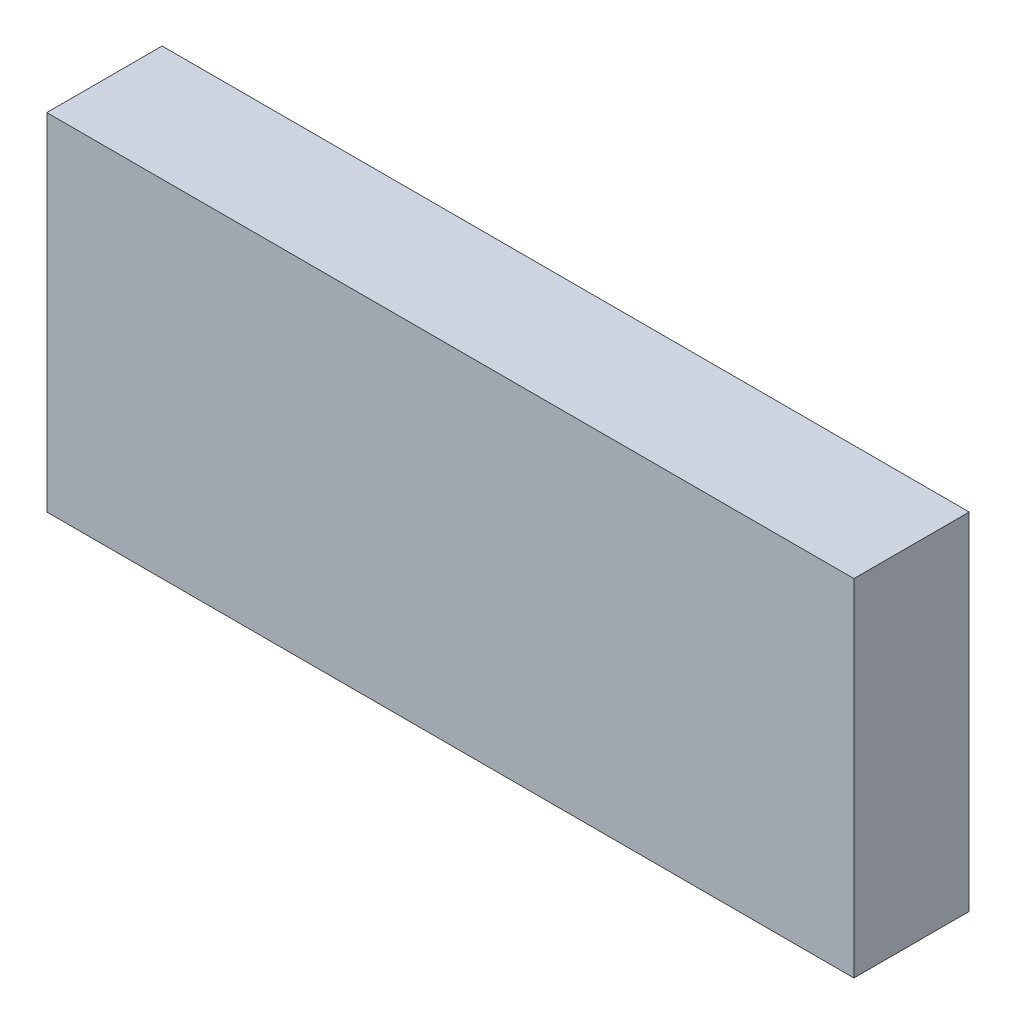
ISO-10303-21;
HEADER;
FILE_DESCRIPTION(('STEP AP214'),'2;1');
FILE_NAME('part.step','',(''),(''),'','','');
FILE_SCHEMA(('AUTOMOTIVE_DESIGN { 1 0 10303 214 1 1 1 1 }'));
ENDSEC;
DATA;
#1=APPLICATION_CONTEXT('core data for automotive mechanical design processes');
#2=APPLICATION_PROTOCOL_DEFINITION('international standard','automotive_design',2000,#1);
#3=PRODUCT_CONTEXT('',#1,'mechanical');
#4=PRODUCT('Part','Part','',(#3));
#5=PRODUCT_RELATED_PRODUCT_CATEGORY('part','',(#4));
#6=PRODUCT_DEFINITION_FORMATION('','',#4);
#7=PRODUCT_DEFINITION_CONTEXT('part definition',#1,'design');
#8=PRODUCT_DEFINITION('design','',#6,#7);
#9=PRODUCT_DEFINITION_SHAPE('','',#8);
#10=(LENGTH_UNIT() NAMED_UNIT(*) SI_UNIT(.MILLI.,.METRE.));
#11=(NAMED_UNIT(*) PLANE_ANGLE_UNIT() SI_UNIT($,.RADIAN.));
#12=(NAMED_UNIT(*) SI_UNIT($,.STERADIAN.) SOLID_ANGLE_UNIT());
#13=UNCERTAINTY_MEASURE_WITH_UNIT(LENGTH_MEASURE(1.E-05),#10,'distance_accuracy_value','');
#14=(GEOMETRIC_REPRESENTATION_CONTEXT(3) GLOBAL_UNCERTAINTY_ASSIGNED_CONTEXT((#13)) GLOBAL_UNIT_ASSIGNED_CONTEXT((#10,
#11,#12)) REPRESENTATION_CONTEXT('',''));
#15=CARTESIAN_POINT('',(0.,0.,0.));
#16=DIRECTION('',(0.,0.,1.));
#17=DIRECTION('',(1.,0.,0.));
#18=AXIS2_PLACEMENT_3D('',#15,#16,#17);
#19=CARTESIAN_POINT('',(0.,0.,1.5));
#20=DIRECTION('',(0.,0.,1.));
#21=DIRECTION('',(1.,0.,0.));
#22=AXIS2_PLACEMENT_3D('',#19,#20,#21);
#23=PLANE('',#22);
#24=DIRECTION('',(1.,0.,0.));
#25=VECTOR('',#24,1.);
#26=CARTESIAN_POINT('',(5.25,2.25,1.5));
#27=LINE('',#26,#25);
#28=CARTESIAN_POINT('',(-5.25,2.25,1.5));
#29=VERTEX_POINT('',#28);
#30=CARTESIAN_POINT('',(5.25,2.25,1.5));
#31=VERTEX_POINT('',#30);
#32=EDGE_CURVE('E68',#29,#31,#27,.T.);
#33=ORIENTED_EDGE('',*,*,#32,.F.);
#34=DIRECTION('',(0.,1.,0.));
#35=VECTOR('',#34,1.);
#36=CARTESIAN_POINT('',(-5.25,2.25,1.5));
#37=LINE('',#36,#35);
#38=CARTESIAN_POINT('',(-5.25,-2.25,1.5));
#39=VERTEX_POINT('',#38);
#40=EDGE_CURVE('E20',#39,#29,#37,.T.);
#41=ORIENTED_EDGE('',*,*,#40,.F.);
#42=DIRECTION('',(1.,0.,0.));
#43=VECTOR('',#42,1.);
#44=CARTESIAN_POINT('',(-5.25,-2.25,1.5));
#45=LINE('',#44,#43);
#46=CARTESIAN_POINT('',(5.25,-2.25,1.5));
#47=VERTEX_POINT('',#46);
#48=EDGE_CURVE('E58',#47,#39,#45,.F.);
#49=ORIENTED_EDGE('',*,*,#48,.F.);
#50=DIRECTION('',(0.,1.,0.));
#51=VECTOR('',#50,1.);
#52=CARTESIAN_POINT('',(5.25,-2.25,1.5));
#53=LINE('',#52,#51);
#54=EDGE_CURVE('E53',#31,#47,#53,.F.);
#55=ORIENTED_EDGE('',*,*,#54,.F.);
#56=EDGE_LOOP('',(#33,#41,#49,#55));
#57=FACE_BOUND('',#56,.T.);
#58=ADVANCED_FACE('F17',(#57),#23,.T.);
#59=CARTESIAN_POINT('',(-5.25,2.25,0.));
#60=DIRECTION('',(-1.,0.,0.));
#61=DIRECTION('',(0.,0.,1.));
#62=AXIS2_PLACEMENT_3D('',#59,#60,#61);
#63=PLANE('',#62);
#64=DIRECTION('',(0.,0.,1.));
#65=VECTOR('',#64,1.);
#66=CARTESIAN_POINT('',(-5.25,2.25,0.));
#67=LINE('',#66,#65);
#68=CARTESIAN_POINT('',(-5.25,2.25,0.));
#69=VERTEX_POINT('',#68);
#70=EDGE_CURVE('E79',#69,#29,#67,.T.);
#71=ORIENTED_EDGE('',*,*,#70,.F.);
#72=DIRECTION('',(0.,1.,0.));
#73=VECTOR('',#72,1.);
#74=CARTESIAN_POINT('',(-5.25,0.,0.));
#75=LINE('',#74,#73);
#76=CARTESIAN_POINT('',(-5.25,-2.25,0.));
#77=VERTEX_POINT('',#76);
#78=EDGE_CURVE('E74',#69,#77,#75,.F.);
#79=ORIENTED_EDGE('',*,*,#78,.T.);
#80=DIRECTION('',(0.,0.,-1.));
#81=VECTOR('',#80,1.);
#82=CARTESIAN_POINT('',(-5.25,-2.25,0.));
#83=LINE('',#82,#81);
#84=EDGE_CURVE('E63',#39,#77,#83,.T.);
#85=ORIENTED_EDGE('',*,*,#84,.F.);
#86=ORIENTED_EDGE('',*,*,#40,.T.);
#87=EDGE_LOOP('',(#71,#79,#85,#86));
#88=FACE_BOUND('',#87,.T.);
#89=ADVANCED_FACE('F73',(#88),#63,.T.);
#90=CARTESIAN_POINT('',(-5.25,-2.25,0.));
#91=DIRECTION('',(0.,-1.,0.));
#92=DIRECTION('',(0.,0.,-1.));
#93=AXIS2_PLACEMENT_3D('',#90,#91,#92);
#94=PLANE('',#93);
#95=ORIENTED_EDGE('',*,*,#84,.T.);
#96=DIRECTION('',(1.,0.,0.));
#97=VECTOR('',#96,1.);
#98=CARTESIAN_POINT('',(0.,-2.25,0.));
#99=LINE('',#98,#97);
#100=CARTESIAN_POINT('',(5.25,-2.25,0.));
#101=VERTEX_POINT('',#100);
#102=EDGE_CURVE('E84',#77,#101,#99,.T.);
#103=ORIENTED_EDGE('',*,*,#102,.T.);
#104=DIRECTION('',(0.,0.,-1.));
#105=VECTOR('',#104,1.);
#106=CARTESIAN_POINT('',(5.25,-2.25,0.));
#107=LINE('',#106,#105);
#108=EDGE_CURVE('E65',#47,#101,#107,.T.);
#109=ORIENTED_EDGE('',*,*,#108,.F.);
#110=ORIENTED_EDGE('',*,*,#48,.T.);
#111=EDGE_LOOP('',(#95,#103,#109,#110));
#112=FACE_BOUND('',#111,.T.);
#113=ADVANCED_FACE('F60',(#112),#94,.T.);
#114=CARTESIAN_POINT('',(5.25,-2.25,0.));
#115=DIRECTION('',(1.,0.,0.));
#116=DIRECTION('',(0.,0.,-1.));
#117=AXIS2_PLACEMENT_3D('',#114,#115,#116);
#118=PLANE('',#117);
#119=ORIENTED_EDGE('',*,*,#108,.T.);
#120=DIRECTION('',(0.,1.,0.));
#121=VECTOR('',#120,1.);
#122=CARTESIAN_POINT('',(5.25,0.,0.));
#123=LINE('',#122,#121);
#124=CARTESIAN_POINT('',(5.25,2.25,0.));
#125=VERTEX_POINT('',#124);
#126=EDGE_CURVE('E26',#101,#125,#123,.T.);
#127=ORIENTED_EDGE('',*,*,#126,.T.);
#128=DIRECTION('',(0.,0.,1.));
#129=VECTOR('',#128,1.);
#130=CARTESIAN_POINT('',(5.25,2.25,0.));
#131=LINE('',#130,#129);
#132=EDGE_CURVE('E34',#31,#125,#131,.F.);
#133=ORIENTED_EDGE('',*,*,#132,.F.);
#134=ORIENTED_EDGE('',*,*,#54,.T.);
#135=EDGE_LOOP('',(#119,#127,#133,#134));
#136=FACE_BOUND('',#135,.T.);
#137=ADVANCED_FACE('F88',(#136),#118,.T.);
#138=CARTESIAN_POINT('',(5.25,2.25,0.));
#139=DIRECTION('',(0.,1.,0.));
#140=DIRECTION('',(0.,0.,1.));
#141=AXIS2_PLACEMENT_3D('',#138,#139,#140);
#142=PLANE('',#141);
#143=ORIENTED_EDGE('',*,*,#132,.T.);
#144=DIRECTION('',(1.,0.,0.));
#145=VECTOR('',#144,1.);
#146=CARTESIAN_POINT('',(0.,2.25,0.));
#147=LINE('',#146,#145);
#148=EDGE_CURVE('E11',#125,#69,#147,.F.);
#149=ORIENTED_EDGE('',*,*,#148,.T.);
#150=ORIENTED_EDGE('',*,*,#70,.T.);
#151=ORIENTED_EDGE('',*,*,#32,.T.);
#152=EDGE_LOOP('',(#143,#149,#150,#151));
#153=FACE_BOUND('',#152,.T.);
#154=ADVANCED_FACE('F91',(#153),#142,.T.);
#155=CARTESIAN_POINT('',(0.,0.,0.));
#156=DIRECTION('',(0.,0.,1.));
#157=DIRECTION('',(1.,0.,0.));
#158=AXIS2_PLACEMENT_3D('',#155,#156,#157);
#159=PLANE('',#158);
#160=ORIENTED_EDGE('',*,*,#126,.F.);
#161=ORIENTED_EDGE('',*,*,#102,.F.);
#162=ORIENTED_EDGE('',*,*,#78,.F.);
#163=ORIENTED_EDGE('',*,*,#148,.F.);
#164=EDGE_LOOP('',(#160,#161,#162,#163));
#165=FACE_BOUND('',#164,.T.);
#166=ADVANCED_FACE('F90',(#165),#159,.F.);
#167=CLOSED_SHELL('',(#58,#89,#113,#137,#154,#166));
#168=MANIFOLD_SOLID_BREP('B1',#167);
#169=ADVANCED_BREP_SHAPE_REPRESENTATION('',(#18,#168),#14);
#170=SHAPE_DEFINITION_REPRESENTATION(#9,#169);
ENDSEC;
END-ISO-10303-21;
